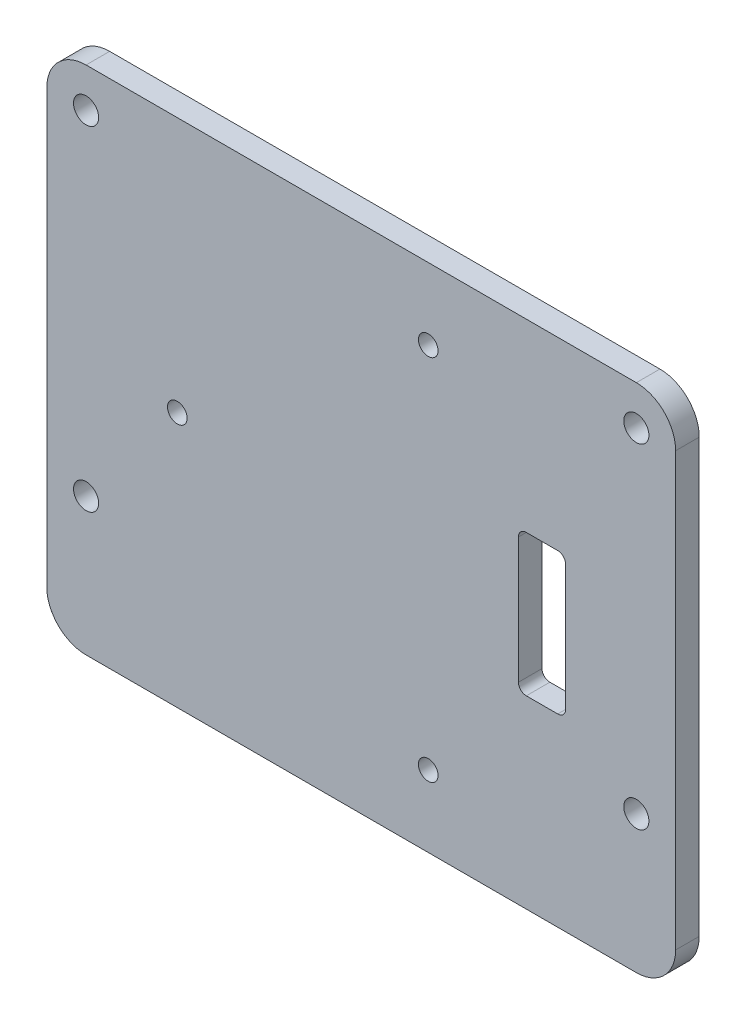
ISO-10303-21;
HEADER;
FILE_DESCRIPTION(('STEP AP214'),'2;1');
FILE_NAME('part.step','',(''),(''),'','','');
FILE_SCHEMA(('AUTOMOTIVE_DESIGN { 1 0 10303 214 1 1 1 1 }'));
ENDSEC;
DATA;
#1=APPLICATION_CONTEXT('core data for automotive mechanical design processes');
#2=APPLICATION_PROTOCOL_DEFINITION('international standard','automotive_design',2000,#1);
#3=PRODUCT_CONTEXT('',#1,'mechanical');
#4=PRODUCT('Part','Part','',(#3));
#5=PRODUCT_RELATED_PRODUCT_CATEGORY('part','',(#4));
#6=PRODUCT_DEFINITION_FORMATION('','',#4);
#7=PRODUCT_DEFINITION_CONTEXT('part definition',#1,'design');
#8=PRODUCT_DEFINITION('design','',#6,#7);
#9=PRODUCT_DEFINITION_SHAPE('','',#8);
#10=(LENGTH_UNIT() NAMED_UNIT(*) SI_UNIT(.MILLI.,.METRE.));
#11=(NAMED_UNIT(*) PLANE_ANGLE_UNIT() SI_UNIT($,.RADIAN.));
#12=(NAMED_UNIT(*) SI_UNIT($,.STERADIAN.) SOLID_ANGLE_UNIT());
#13=UNCERTAINTY_MEASURE_WITH_UNIT(LENGTH_MEASURE(1.E-05),#10,'distance_accuracy_value','');
#14=(GEOMETRIC_REPRESENTATION_CONTEXT(3) GLOBAL_UNCERTAINTY_ASSIGNED_CONTEXT((#13)) GLOBAL_UNIT_ASSIGNED_CONTEXT((#10,
#11,#12)) REPRESENTATION_CONTEXT('',''));
#15=CARTESIAN_POINT('',(0.,0.,0.));
#16=DIRECTION('',(0.,0.,1.));
#17=DIRECTION('',(1.,0.,0.));
#18=AXIS2_PLACEMENT_3D('',#15,#16,#17);
#19=CARTESIAN_POINT('',(0.,0.,3.));
#20=DIRECTION('',(0.,0.,1.));
#21=DIRECTION('',(1.,0.,0.));
#22=AXIS2_PLACEMENT_3D('',#19,#20,#21);
#23=PLANE('',#22);
#24=DIRECTION('',(1.,0.,0.));
#25=VECTOR('',#24,1.);
#26=CARTESIAN_POINT('',(26.,9.,3.));
#27=LINE('',#26,#25);
#28=CARTESIAN_POINT('',(21.,9.,3.));
#29=VERTEX_POINT('',#28);
#30=CARTESIAN_POINT('',(25.,9.,3.));
#31=VERTEX_POINT('',#30);
#32=EDGE_CURVE('E262',#29,#31,#27,.T.);
#33=ORIENTED_EDGE('',*,*,#32,.T.);
#34=CARTESIAN_POINT('',(25.,8.,3.));
#35=DIRECTION('',(0.,0.,1.));
#36=DIRECTION('',(1.,0.,0.));
#37=AXIS2_PLACEMENT_3D('',#34,#35,#36);
#38=CIRCLE('',#37,1.);
#39=CARTESIAN_POINT('',(26.,8.,3.));
#40=VERTEX_POINT('',#39);
#41=EDGE_CURVE('E240',#31,#40,#38,.F.);
#42=ORIENTED_EDGE('',*,*,#41,.T.);
#43=DIRECTION('',(0.,-1.,0.));
#44=VECTOR('',#43,1.);
#45=CARTESIAN_POINT('',(26.,9.,3.));
#46=LINE('',#45,#44);
#47=CARTESIAN_POINT('',(26.,-8.,3.));
#48=VERTEX_POINT('',#47);
#49=EDGE_CURVE('E283',#40,#48,#46,.T.);
#50=ORIENTED_EDGE('',*,*,#49,.T.);
#51=CARTESIAN_POINT('',(25.,-8.,3.));
#52=DIRECTION('',(0.,0.,1.));
#53=DIRECTION('',(1.,0.,0.));
#54=AXIS2_PLACEMENT_3D('',#51,#52,#53);
#55=CIRCLE('',#54,1.);
#56=CARTESIAN_POINT('',(25.,-9.,3.));
#57=VERTEX_POINT('',#56);
#58=EDGE_CURVE('E236',#48,#57,#55,.F.);
#59=ORIENTED_EDGE('',*,*,#58,.T.);
#60=DIRECTION('',(-1.,0.,0.));
#61=VECTOR('',#60,1.);
#62=CARTESIAN_POINT('',(26.,-9.,3.));
#63=LINE('',#62,#61);
#64=CARTESIAN_POINT('',(21.,-9.,3.));
#65=VERTEX_POINT('',#64);
#66=EDGE_CURVE('E273',#57,#65,#63,.T.);
#67=ORIENTED_EDGE('',*,*,#66,.T.);
#68=CARTESIAN_POINT('',(21.,-8.,3.));
#69=DIRECTION('',(0.,0.,1.));
#70=DIRECTION('',(1.,0.,0.));
#71=AXIS2_PLACEMENT_3D('',#68,#69,#70);
#72=CIRCLE('',#71,1.);
#73=CARTESIAN_POINT('',(20.,-8.,3.));
#74=VERTEX_POINT('',#73);
#75=EDGE_CURVE('E59',#65,#74,#72,.F.);
#76=ORIENTED_EDGE('',*,*,#75,.T.);
#77=DIRECTION('',(0.,1.,0.));
#78=VECTOR('',#77,1.);
#79=CARTESIAN_POINT('',(20.,9.,3.));
#80=LINE('',#79,#78);
#81=CARTESIAN_POINT('',(20.,8.,3.));
#82=VERTEX_POINT('',#81);
#83=EDGE_CURVE('E264',#74,#82,#80,.T.);
#84=ORIENTED_EDGE('',*,*,#83,.T.);
#85=CARTESIAN_POINT('',(21.,8.,3.));
#86=DIRECTION('',(0.,0.,1.));
#87=DIRECTION('',(1.,0.,0.));
#88=AXIS2_PLACEMENT_3D('',#85,#86,#87);
#89=CIRCLE('',#88,1.);
#90=EDGE_CURVE('E11',#82,#29,#89,.F.);
#91=ORIENTED_EDGE('',*,*,#90,.T.);
#92=EDGE_LOOP('',(#33,#42,#50,#59,#67,#76,#84,#91));
#93=FACE_BOUND('',#92,.T.);
#94=CARTESIAN_POINT('',(35.,-15.,3.));
#95=DIRECTION('',(0.,0.,-1.));
#96=DIRECTION('',(-1.,0.,0.));
#97=AXIS2_PLACEMENT_3D('',#94,#95,#96);
#98=CIRCLE('',#97,1.6);
#99=CARTESIAN_POINT('',(33.4,-15.,3.));
#100=VERTEX_POINT('',#99);
#101=EDGE_CURVE('E287',#100,#100,#98,.T.);
#102=ORIENTED_EDGE('',*,*,#101,.T.);
#103=EDGE_LOOP('',(#102));
#104=FACE_BOUND('',#103,.T.);
#105=CARTESIAN_POINT('',(-35.,27.5,3.));
#106=DIRECTION('',(0.,0.,-1.));
#107=DIRECTION('',(-1.,0.,0.));
#108=AXIS2_PLACEMENT_3D('',#105,#106,#107);
#109=CIRCLE('',#108,1.6);
#110=CARTESIAN_POINT('',(-36.6,27.5,3.));
#111=VERTEX_POINT('',#110);
#112=EDGE_CURVE('E294',#111,#111,#109,.T.);
#113=ORIENTED_EDGE('',*,*,#112,.T.);
#114=EDGE_LOOP('',(#113));
#115=FACE_BOUND('',#114,.T.);
#116=CARTESIAN_POINT('',(-35.,-15.,3.));
#117=DIRECTION('',(0.,0.,-1.));
#118=DIRECTION('',(-1.,0.,0.));
#119=AXIS2_PLACEMENT_3D('',#116,#117,#118);
#120=CIRCLE('',#119,1.6);
#121=CARTESIAN_POINT('',(-36.6,-15.,3.));
#122=VERTEX_POINT('',#121);
#123=EDGE_CURVE('E271',#122,#122,#120,.T.);
#124=ORIENTED_EDGE('',*,*,#123,.T.);
#125=EDGE_LOOP('',(#124));
#126=FACE_BOUND('',#125,.T.);
#127=CARTESIAN_POINT('',(35.,27.5,3.));
#128=DIRECTION('',(0.,0.,-1.));
#129=DIRECTION('',(-1.,0.,0.));
#130=AXIS2_PLACEMENT_3D('',#127,#128,#129);
#131=CIRCLE('',#130,1.6);
#132=CARTESIAN_POINT('',(33.4,27.5,3.));
#133=VERTEX_POINT('',#132);
#134=EDGE_CURVE('E299',#133,#133,#131,.T.);
#135=ORIENTED_EDGE('',*,*,#134,.T.);
#136=EDGE_LOOP('',(#135));
#137=FACE_BOUND('',#136,.T.);
#138=CARTESIAN_POINT('',(8.52683370307192,-23.3999945261768,3.));
#139=DIRECTION('',(0.,0.,1.));
#140=DIRECTION('',(1.,0.,0.));
#141=AXIS2_PLACEMENT_3D('',#138,#139,#140);
#142=CIRCLE('',#141,1.25);
#143=CARTESIAN_POINT('',(9.77683370307192,-23.3999945261768,3.));
#144=VERTEX_POINT('',#143);
#145=EDGE_CURVE('E311',#144,#144,#142,.T.);
#146=ORIENTED_EDGE('',*,*,#145,.F.);
#147=EDGE_LOOP('',(#146));
#148=FACE_BOUND('',#147,.T.);
#149=DIRECTION('',(1.,0.,0.));
#150=VECTOR('',#149,1.);
#151=CARTESIAN_POINT('',(-40.,-32.5,3.));
#152=LINE('',#151,#150);
#153=CARTESIAN_POINT('',(-35.,-32.5,3.));
#154=VERTEX_POINT('',#153);
#155=CARTESIAN_POINT('',(35.,-32.5,3.));
#156=VERTEX_POINT('',#155);
#157=EDGE_CURVE('E324',#154,#156,#152,.T.);
#158=ORIENTED_EDGE('',*,*,#157,.T.);
#159=CARTESIAN_POINT('',(35.,-27.5,3.));
#160=DIRECTION('',(0.,0.,1.));
#161=DIRECTION('',(1.,0.,0.));
#162=AXIS2_PLACEMENT_3D('',#159,#160,#161);
#163=CIRCLE('',#162,5.);
#164=CARTESIAN_POINT('',(40.,-27.5,3.));
#165=VERTEX_POINT('',#164);
#166=EDGE_CURVE('E203',#156,#165,#163,.T.);
#167=ORIENTED_EDGE('',*,*,#166,.T.);
#168=DIRECTION('',(0.,1.,0.));
#169=VECTOR('',#168,1.);
#170=CARTESIAN_POINT('',(40.,32.5,3.));
#171=LINE('',#170,#169);
#172=CARTESIAN_POINT('',(40.,27.5,3.));
#173=VERTEX_POINT('',#172);
#174=EDGE_CURVE('E171',#165,#173,#171,.T.);
#175=ORIENTED_EDGE('',*,*,#174,.T.);
#176=CARTESIAN_POINT('',(35.,27.5,3.));
#177=DIRECTION('',(0.,0.,1.));
#178=DIRECTION('',(1.,0.,0.));
#179=AXIS2_PLACEMENT_3D('',#176,#177,#178);
#180=CIRCLE('',#179,5.);
#181=CARTESIAN_POINT('',(35.,32.5,3.));
#182=VERTEX_POINT('',#181);
#183=EDGE_CURVE('E199',#173,#182,#180,.T.);
#184=ORIENTED_EDGE('',*,*,#183,.T.);
#185=DIRECTION('',(-1.,0.,0.));
#186=VECTOR('',#185,1.);
#187=CARTESIAN_POINT('',(-40.,32.5,3.));
#188=LINE('',#187,#186);
#189=CARTESIAN_POINT('',(-35.,32.5,3.));
#190=VERTEX_POINT('',#189);
#191=EDGE_CURVE('E189',#182,#190,#188,.T.);
#192=ORIENTED_EDGE('',*,*,#191,.T.);
#193=CARTESIAN_POINT('',(-35.,27.5,3.));
#194=DIRECTION('',(0.,0.,1.));
#195=DIRECTION('',(1.,0.,0.));
#196=AXIS2_PLACEMENT_3D('',#193,#194,#195);
#197=CIRCLE('',#196,5.);
#198=CARTESIAN_POINT('',(-40.,27.5,3.));
#199=VERTEX_POINT('',#198);
#200=EDGE_CURVE('E197',#190,#199,#197,.T.);
#201=ORIENTED_EDGE('',*,*,#200,.T.);
#202=DIRECTION('',(0.,-1.,0.));
#203=VECTOR('',#202,1.);
#204=CARTESIAN_POINT('',(-40.,32.5,3.));
#205=LINE('',#204,#203);
#206=CARTESIAN_POINT('',(-40.,-27.5,3.));
#207=VERTEX_POINT('',#206);
#208=EDGE_CURVE('E183',#199,#207,#205,.T.);
#209=ORIENTED_EDGE('',*,*,#208,.T.);
#210=CARTESIAN_POINT('',(-35.,-27.5,3.));
#211=DIRECTION('',(0.,0.,1.));
#212=DIRECTION('',(1.,0.,0.));
#213=AXIS2_PLACEMENT_3D('',#210,#211,#212);
#214=CIRCLE('',#213,5.);
#215=EDGE_CURVE('E201',#207,#154,#214,.T.);
#216=ORIENTED_EDGE('',*,*,#215,.T.);
#217=EDGE_LOOP('',(#158,#167,#175,#184,#192,#201,#209,#216));
#218=FACE_BOUND('',#217,.T.);
#219=CARTESIAN_POINT('',(8.52683370307192,23.4000054738232,3.));
#220=DIRECTION('',(0.,0.,1.));
#221=DIRECTION('',(1.,0.,0.));
#222=AXIS2_PLACEMENT_3D('',#219,#220,#221);
#223=CIRCLE('',#222,1.25);
#224=CARTESIAN_POINT('',(9.77683370307192,23.4000054738232,3.));
#225=VERTEX_POINT('',#224);
#226=EDGE_CURVE('E317',#225,#225,#223,.T.);
#227=ORIENTED_EDGE('',*,*,#226,.F.);
#228=EDGE_LOOP('',(#227));
#229=FACE_BOUND('',#228,.T.);
#230=CARTESIAN_POINT('',(-23.3931662969281,5.4738231953523E-06,3.));
#231=DIRECTION('',(0.,0.,1.));
#232=DIRECTION('',(1.,0.,0.));
#233=AXIS2_PLACEMENT_3D('',#230,#231,#232);
#234=CIRCLE('',#233,1.25);
#235=CARTESIAN_POINT('',(-22.1431662969281,5.4738231953523E-06,3.));
#236=VERTEX_POINT('',#235);
#237=EDGE_CURVE('E305',#236,#236,#234,.T.);
#238=ORIENTED_EDGE('',*,*,#237,.F.);
#239=EDGE_LOOP('',(#238));
#240=FACE_BOUND('',#239,.T.);
#241=ADVANCED_FACE('F37',(#93,#104,#115,#126,#137,#148,#218,#229,#240),#23,.T.);
#242=CARTESIAN_POINT('',(0.,0.,0.));
#243=DIRECTION('',(0.,0.,1.));
#244=DIRECTION('',(1.,0.,0.));
#245=AXIS2_PLACEMENT_3D('',#242,#243,#244);
#246=PLANE('',#245);
#247=DIRECTION('',(-1.,0.,0.));
#248=VECTOR('',#247,1.);
#249=CARTESIAN_POINT('',(26.,-9.,0.));
#250=LINE('',#249,#248);
#251=CARTESIAN_POINT('',(25.,-9.,0.));
#252=VERTEX_POINT('',#251);
#253=CARTESIAN_POINT('',(21.,-9.,0.));
#254=VERTEX_POINT('',#253);
#255=EDGE_CURVE('E256',#252,#254,#250,.T.);
#256=ORIENTED_EDGE('',*,*,#255,.F.);
#257=CARTESIAN_POINT('',(25.,-8.,0.));
#258=DIRECTION('',(0.,0.,1.));
#259=DIRECTION('',(1.,0.,0.));
#260=AXIS2_PLACEMENT_3D('',#257,#258,#259);
#261=CIRCLE('',#260,1.);
#262=CARTESIAN_POINT('',(26.,-8.,0.));
#263=VERTEX_POINT('',#262);
#264=EDGE_CURVE('E234',#252,#263,#261,.T.);
#265=ORIENTED_EDGE('',*,*,#264,.T.);
#266=DIRECTION('',(0.,-1.,0.));
#267=VECTOR('',#266,1.);
#268=CARTESIAN_POINT('',(26.,9.,0.));
#269=LINE('',#268,#267);
#270=CARTESIAN_POINT('',(26.,8.,0.));
#271=VERTEX_POINT('',#270);
#272=EDGE_CURVE('E277',#271,#263,#269,.T.);
#273=ORIENTED_EDGE('',*,*,#272,.F.);
#274=CARTESIAN_POINT('',(25.,8.,0.));
#275=DIRECTION('',(0.,0.,1.));
#276=DIRECTION('',(1.,0.,0.));
#277=AXIS2_PLACEMENT_3D('',#274,#275,#276);
#278=CIRCLE('',#277,1.);
#279=CARTESIAN_POINT('',(25.,9.,0.));
#280=VERTEX_POINT('',#279);
#281=EDGE_CURVE('E238',#271,#280,#278,.T.);
#282=ORIENTED_EDGE('',*,*,#281,.T.);
#283=DIRECTION('',(1.,0.,0.));
#284=VECTOR('',#283,1.);
#285=CARTESIAN_POINT('',(26.,9.,0.));
#286=LINE('',#285,#284);
#287=CARTESIAN_POINT('',(21.,9.,0.));
#288=VERTEX_POINT('',#287);
#289=EDGE_CURVE('E251',#288,#280,#286,.T.);
#290=ORIENTED_EDGE('',*,*,#289,.F.);
#291=CARTESIAN_POINT('',(21.,8.,0.));
#292=DIRECTION('',(0.,0.,1.));
#293=DIRECTION('',(1.,0.,0.));
#294=AXIS2_PLACEMENT_3D('',#291,#292,#293);
#295=CIRCLE('',#294,1.);
#296=CARTESIAN_POINT('',(20.,8.,0.));
#297=VERTEX_POINT('',#296);
#298=EDGE_CURVE('E45',#288,#297,#295,.T.);
#299=ORIENTED_EDGE('',*,*,#298,.T.);
#300=DIRECTION('',(0.,1.,0.));
#301=VECTOR('',#300,1.);
#302=CARTESIAN_POINT('',(20.,9.,0.));
#303=LINE('',#302,#301);
#304=CARTESIAN_POINT('',(20.,-8.,0.));
#305=VERTEX_POINT('',#304);
#306=EDGE_CURVE('E249',#305,#297,#303,.T.);
#307=ORIENTED_EDGE('',*,*,#306,.F.);
#308=CARTESIAN_POINT('',(21.,-8.,0.));
#309=DIRECTION('',(0.,0.,1.));
#310=DIRECTION('',(1.,0.,0.));
#311=AXIS2_PLACEMENT_3D('',#308,#309,#310);
#312=CIRCLE('',#311,1.);
#313=EDGE_CURVE('E242',#305,#254,#312,.T.);
#314=ORIENTED_EDGE('',*,*,#313,.T.);
#315=EDGE_LOOP('',(#256,#265,#273,#282,#290,#299,#307,#314));
#316=FACE_BOUND('',#315,.T.);
#317=CARTESIAN_POINT('',(35.,-15.,0.));
#318=DIRECTION('',(0.,0.,-1.));
#319=DIRECTION('',(-1.,0.,0.));
#320=AXIS2_PLACEMENT_3D('',#317,#318,#319);
#321=CIRCLE('',#320,1.6);
#322=CARTESIAN_POINT('',(33.4,-15.,0.));
#323=VERTEX_POINT('',#322);
#324=EDGE_CURVE('E291',#323,#323,#321,.T.);
#325=ORIENTED_EDGE('',*,*,#324,.F.);
#326=EDGE_LOOP('',(#325));
#327=FACE_BOUND('',#326,.T.);
#328=CARTESIAN_POINT('',(-35.,27.5,0.));
#329=DIRECTION('',(0.,0.,-1.));
#330=DIRECTION('',(-1.,0.,0.));
#331=AXIS2_PLACEMENT_3D('',#328,#329,#330);
#332=CIRCLE('',#331,1.6);
#333=CARTESIAN_POINT('',(-36.6,27.5,0.));
#334=VERTEX_POINT('',#333);
#335=EDGE_CURVE('E285',#334,#334,#332,.T.);
#336=ORIENTED_EDGE('',*,*,#335,.F.);
#337=EDGE_LOOP('',(#336));
#338=FACE_BOUND('',#337,.T.);
#339=CARTESIAN_POINT('',(-35.,-15.,0.));
#340=DIRECTION('',(0.,0.,-1.));
#341=DIRECTION('',(-1.,0.,0.));
#342=AXIS2_PLACEMENT_3D('',#339,#340,#341);
#343=CIRCLE('',#342,1.6);
#344=CARTESIAN_POINT('',(-36.6,-15.,0.));
#345=VERTEX_POINT('',#344);
#346=EDGE_CURVE('E268',#345,#345,#343,.T.);
#347=ORIENTED_EDGE('',*,*,#346,.F.);
#348=EDGE_LOOP('',(#347));
#349=FACE_BOUND('',#348,.T.);
#350=CARTESIAN_POINT('',(35.,27.5,0.));
#351=DIRECTION('',(0.,0.,-1.));
#352=DIRECTION('',(-1.,0.,0.));
#353=AXIS2_PLACEMENT_3D('',#350,#351,#352);
#354=CIRCLE('',#353,1.6);
#355=CARTESIAN_POINT('',(33.4,27.5,0.));
#356=VERTEX_POINT('',#355);
#357=EDGE_CURVE('E290',#356,#356,#354,.T.);
#358=ORIENTED_EDGE('',*,*,#357,.F.);
#359=EDGE_LOOP('',(#358));
#360=FACE_BOUND('',#359,.T.);
#361=DIRECTION('',(0.,1.,0.));
#362=VECTOR('',#361,1.);
#363=CARTESIAN_POINT('',(40.,32.5,0.));
#364=LINE('',#363,#362);
#365=CARTESIAN_POINT('',(40.,-27.5,0.));
#366=VERTEX_POINT('',#365);
#367=CARTESIAN_POINT('',(40.,27.5,0.));
#368=VERTEX_POINT('',#367);
#369=EDGE_CURVE('E168',#366,#368,#364,.T.);
#370=ORIENTED_EDGE('',*,*,#369,.F.);
#371=CARTESIAN_POINT('',(35.,-27.5,0.));
#372=DIRECTION('',(0.,0.,1.));
#373=DIRECTION('',(1.,0.,0.));
#374=AXIS2_PLACEMENT_3D('',#371,#372,#373);
#375=CIRCLE('',#374,5.);
#376=CARTESIAN_POINT('',(35.,-32.5,0.));
#377=VERTEX_POINT('',#376);
#378=EDGE_CURVE('E151',#366,#377,#375,.F.);
#379=ORIENTED_EDGE('',*,*,#378,.T.);
#380=DIRECTION('',(1.,0.,0.));
#381=VECTOR('',#380,1.);
#382=CARTESIAN_POINT('',(-40.,-32.5,0.));
#383=LINE('',#382,#381);
#384=CARTESIAN_POINT('',(-35.,-32.5,0.));
#385=VERTEX_POINT('',#384);
#386=EDGE_CURVE('E180',#385,#377,#383,.T.);
#387=ORIENTED_EDGE('',*,*,#386,.F.);
#388=CARTESIAN_POINT('',(-35.,-27.5,0.));
#389=DIRECTION('',(0.,0.,1.));
#390=DIRECTION('',(1.,0.,0.));
#391=AXIS2_PLACEMENT_3D('',#388,#389,#390);
#392=CIRCLE('',#391,5.);
#393=CARTESIAN_POINT('',(-40.,-27.5,0.));
#394=VERTEX_POINT('',#393);
#395=EDGE_CURVE('E162',#385,#394,#392,.F.);
#396=ORIENTED_EDGE('',*,*,#395,.T.);
#397=DIRECTION('',(0.,-1.,0.));
#398=VECTOR('',#397,1.);
#399=CARTESIAN_POINT('',(-40.,32.5,0.));
#400=LINE('',#399,#398);
#401=CARTESIAN_POINT('',(-40.,27.5,0.));
#402=VERTEX_POINT('',#401);
#403=EDGE_CURVE('E185',#402,#394,#400,.T.);
#404=ORIENTED_EDGE('',*,*,#403,.F.);
#405=CARTESIAN_POINT('',(-35.,27.5,0.));
#406=DIRECTION('',(0.,0.,1.));
#407=DIRECTION('',(1.,0.,0.));
#408=AXIS2_PLACEMENT_3D('',#405,#406,#407);
#409=CIRCLE('',#408,5.);
#410=CARTESIAN_POINT('',(-35.,32.5,0.));
#411=VERTEX_POINT('',#410);
#412=EDGE_CURVE('E172',#402,#411,#409,.F.);
#413=ORIENTED_EDGE('',*,*,#412,.T.);
#414=DIRECTION('',(-1.,0.,0.));
#415=VECTOR('',#414,1.);
#416=CARTESIAN_POINT('',(-40.,32.5,0.));
#417=LINE('',#416,#415);
#418=CARTESIAN_POINT('',(35.,32.5,0.));
#419=VERTEX_POINT('',#418);
#420=EDGE_CURVE('E179',#419,#411,#417,.T.);
#421=ORIENTED_EDGE('',*,*,#420,.F.);
#422=CARTESIAN_POINT('',(35.,27.5,0.));
#423=DIRECTION('',(0.,0.,1.));
#424=DIRECTION('',(1.,0.,0.));
#425=AXIS2_PLACEMENT_3D('',#422,#423,#424);
#426=CIRCLE('',#425,5.);
#427=EDGE_CURVE('E178',#419,#368,#426,.F.);
#428=ORIENTED_EDGE('',*,*,#427,.T.);
#429=EDGE_LOOP('',(#370,#379,#387,#396,#404,#413,#421,#428));
#430=FACE_BOUND('',#429,.T.);
#431=CARTESIAN_POINT('',(8.52683370307192,23.4000054738232,0.));
#432=DIRECTION('',(0.,0.,1.));
#433=DIRECTION('',(1.,0.,0.));
#434=AXIS2_PLACEMENT_3D('',#431,#432,#433);
#435=CIRCLE('',#434,1.25);
#436=CARTESIAN_POINT('',(9.77683370307192,23.4000054738232,0.));
#437=VERTEX_POINT('',#436);
#438=EDGE_CURVE('E314',#437,#437,#435,.T.);
#439=ORIENTED_EDGE('',*,*,#438,.T.);
#440=EDGE_LOOP('',(#439));
#441=FACE_BOUND('',#440,.T.);
#442=CARTESIAN_POINT('',(8.52683370307192,-23.3999945261768,0.));
#443=DIRECTION('',(0.,0.,1.));
#444=DIRECTION('',(1.,0.,0.));
#445=AXIS2_PLACEMENT_3D('',#442,#443,#444);
#446=CIRCLE('',#445,1.25);
#447=CARTESIAN_POINT('',(9.77683370307192,-23.3999945261768,0.));
#448=VERTEX_POINT('',#447);
#449=EDGE_CURVE('E308',#448,#448,#446,.T.);
#450=ORIENTED_EDGE('',*,*,#449,.T.);
#451=EDGE_LOOP('',(#450));
#452=FACE_BOUND('',#451,.T.);
#453=CARTESIAN_POINT('',(-23.3931662969281,5.4738231953523E-06,0.));
#454=DIRECTION('',(0.,0.,1.));
#455=DIRECTION('',(1.,0.,0.));
#456=AXIS2_PLACEMENT_3D('',#453,#454,#455);
#457=CIRCLE('',#456,1.25);
#458=CARTESIAN_POINT('',(-22.1431662969281,5.4738231953523E-06,0.));
#459=VERTEX_POINT('',#458);
#460=EDGE_CURVE('E302',#459,#459,#457,.T.);
#461=ORIENTED_EDGE('',*,*,#460,.T.);
#462=EDGE_LOOP('',(#461));
#463=FACE_BOUND('',#462,.T.);
#464=ADVANCED_FACE('F175',(#316,#327,#338,#349,#360,#430,#441,#452,#463),#246,.F.);
#465=CARTESIAN_POINT('',(-40.,32.5,3.));
#466=DIRECTION('',(1.,0.,0.));
#467=DIRECTION('',(0.,1.,0.));
#468=AXIS2_PLACEMENT_3D('',#465,#466,#467);
#469=PLANE('',#468);
#470=ORIENTED_EDGE('',*,*,#403,.T.);
#471=DIRECTION('',(0.,0.,-1.));
#472=VECTOR('',#471,1.);
#473=CARTESIAN_POINT('',(-40.,-27.5,3.));
#474=LINE('',#473,#472);
#475=EDGE_CURVE('E208',#394,#207,#474,.F.);
#476=ORIENTED_EDGE('',*,*,#475,.T.);
#477=ORIENTED_EDGE('',*,*,#208,.F.);
#478=DIRECTION('',(0.,0.,-1.));
#479=VECTOR('',#478,1.);
#480=CARTESIAN_POINT('',(-40.,27.5,3.));
#481=LINE('',#480,#479);
#482=EDGE_CURVE('E205',#199,#402,#481,.T.);
#483=ORIENTED_EDGE('',*,*,#482,.T.);
#484=EDGE_LOOP('',(#470,#476,#477,#483));
#485=FACE_BOUND('',#484,.T.);
#486=ADVANCED_FACE('F333',(#485),#469,.F.);
#487=CARTESIAN_POINT('',(-40.,-32.5,3.));
#488=DIRECTION('',(0.,1.,0.));
#489=DIRECTION('',(0.,0.,1.));
#490=AXIS2_PLACEMENT_3D('',#487,#488,#489);
#491=PLANE('',#490);
#492=ORIENTED_EDGE('',*,*,#386,.T.);
#493=DIRECTION('',(0.,0.,-1.));
#494=VECTOR('',#493,1.);
#495=CARTESIAN_POINT('',(35.,-32.5,3.));
#496=LINE('',#495,#494);
#497=EDGE_CURVE('E156',#377,#156,#496,.F.);
#498=ORIENTED_EDGE('',*,*,#497,.T.);
#499=ORIENTED_EDGE('',*,*,#157,.F.);
#500=DIRECTION('',(0.,0.,-1.));
#501=VECTOR('',#500,1.);
#502=CARTESIAN_POINT('',(-35.,-32.5,3.));
#503=LINE('',#502,#501);
#504=EDGE_CURVE('E161',#154,#385,#503,.T.);
#505=ORIENTED_EDGE('',*,*,#504,.T.);
#506=EDGE_LOOP('',(#492,#498,#499,#505));
#507=FACE_BOUND('',#506,.T.);
#508=ADVANCED_FACE('F344',(#507),#491,.F.);
#509=CARTESIAN_POINT('',(40.,32.5,3.));
#510=DIRECTION('',(-1.,0.,0.));
#511=DIRECTION('',(0.,0.,1.));
#512=AXIS2_PLACEMENT_3D('',#509,#510,#511);
#513=PLANE('',#512);
#514=ORIENTED_EDGE('',*,*,#174,.F.);
#515=DIRECTION('',(0.,0.,-1.));
#516=VECTOR('',#515,1.);
#517=CARTESIAN_POINT('',(40.,-27.5,3.));
#518=LINE('',#517,#516);
#519=EDGE_CURVE('E155',#165,#366,#518,.T.);
#520=ORIENTED_EDGE('',*,*,#519,.T.);
#521=ORIENTED_EDGE('',*,*,#369,.T.);
#522=DIRECTION('',(0.,0.,-1.));
#523=VECTOR('',#522,1.);
#524=CARTESIAN_POINT('',(40.,27.5,3.));
#525=LINE('',#524,#523);
#526=EDGE_CURVE('E173',#368,#173,#525,.F.);
#527=ORIENTED_EDGE('',*,*,#526,.T.);
#528=EDGE_LOOP('',(#514,#520,#521,#527));
#529=FACE_BOUND('',#528,.T.);
#530=ADVANCED_FACE('F167',(#529),#513,.F.);
#531=CARTESIAN_POINT('',(-40.,32.5,3.));
#532=DIRECTION('',(0.,-1.,0.));
#533=DIRECTION('',(0.,0.,-1.));
#534=AXIS2_PLACEMENT_3D('',#531,#532,#533);
#535=PLANE('',#534);
#536=ORIENTED_EDGE('',*,*,#191,.F.);
#537=DIRECTION('',(0.,0.,-1.));
#538=VECTOR('',#537,1.);
#539=CARTESIAN_POINT('',(35.,32.5,3.));
#540=LINE('',#539,#538);
#541=EDGE_CURVE('E212',#182,#419,#540,.T.);
#542=ORIENTED_EDGE('',*,*,#541,.T.);
#543=ORIENTED_EDGE('',*,*,#420,.T.);
#544=DIRECTION('',(0.,0.,-1.));
#545=VECTOR('',#544,1.);
#546=CARTESIAN_POINT('',(-35.,32.5,3.));
#547=LINE('',#546,#545);
#548=EDGE_CURVE('E210',#411,#190,#547,.F.);
#549=ORIENTED_EDGE('',*,*,#548,.T.);
#550=EDGE_LOOP('',(#536,#542,#543,#549));
#551=FACE_BOUND('',#550,.T.);
#552=ADVANCED_FACE('F351',(#551),#535,.F.);
#553=CARTESIAN_POINT('',(8.52683370307192,23.4000054738232,3.));
#554=DIRECTION('',(0.,0.,-1.));
#555=DIRECTION('',(-1.,0.,0.));
#556=AXIS2_PLACEMENT_3D('',#553,#554,#555);
#557=CYLINDRICAL_SURFACE('',#556,1.25);
#558=ORIENTED_EDGE('',*,*,#226,.T.);
#559=EDGE_LOOP('',(#558));
#560=FACE_BOUND('',#559,.T.);
#561=ORIENTED_EDGE('',*,*,#438,.F.);
#562=EDGE_LOOP('',(#561));
#563=FACE_BOUND('',#562,.T.);
#564=ADVANCED_FACE('F361',(#560,#563),#557,.F.);
#565=CARTESIAN_POINT('',(8.52683370307192,-23.3999945261768,3.));
#566=DIRECTION('',(0.,0.,-1.));
#567=DIRECTION('',(-1.,0.,0.));
#568=AXIS2_PLACEMENT_3D('',#565,#566,#567);
#569=CYLINDRICAL_SURFACE('',#568,1.25);
#570=ORIENTED_EDGE('',*,*,#145,.T.);
#571=EDGE_LOOP('',(#570));
#572=FACE_BOUND('',#571,.T.);
#573=ORIENTED_EDGE('',*,*,#449,.F.);
#574=EDGE_LOOP('',(#573));
#575=FACE_BOUND('',#574,.T.);
#576=ADVANCED_FACE('F369',(#572,#575),#569,.F.);
#577=CARTESIAN_POINT('',(-23.3931662969281,5.4738231953523E-06,3.));
#578=DIRECTION('',(0.,0.,-1.));
#579=DIRECTION('',(-1.,0.,0.));
#580=AXIS2_PLACEMENT_3D('',#577,#578,#579);
#581=CYLINDRICAL_SURFACE('',#580,1.25);
#582=ORIENTED_EDGE('',*,*,#237,.T.);
#583=EDGE_LOOP('',(#582));
#584=FACE_BOUND('',#583,.T.);
#585=ORIENTED_EDGE('',*,*,#460,.F.);
#586=EDGE_LOOP('',(#585));
#587=FACE_BOUND('',#586,.T.);
#588=ADVANCED_FACE('F442',(#584,#587),#581,.F.);
#589=CARTESIAN_POINT('',(35.,-27.5,3.));
#590=DIRECTION('',(0.,0.,-1.));
#591=DIRECTION('',(-1.,0.,0.));
#592=AXIS2_PLACEMENT_3D('',#589,#590,#591);
#593=CYLINDRICAL_SURFACE('',#592,5.);
#594=ORIENTED_EDGE('',*,*,#166,.F.);
#595=ORIENTED_EDGE('',*,*,#497,.F.);
#596=ORIENTED_EDGE('',*,*,#378,.F.);
#597=ORIENTED_EDGE('',*,*,#519,.F.);
#598=EDGE_LOOP('',(#594,#595,#596,#597));
#599=FACE_BOUND('',#598,.T.);
#600=ADVANCED_FACE('F154',(#599),#593,.T.);
#601=CARTESIAN_POINT('',(-35.,-27.5,3.));
#602=DIRECTION('',(0.,0.,-1.));
#603=DIRECTION('',(-1.,0.,0.));
#604=AXIS2_PLACEMENT_3D('',#601,#602,#603);
#605=CYLINDRICAL_SURFACE('',#604,5.);
#606=ORIENTED_EDGE('',*,*,#215,.F.);
#607=ORIENTED_EDGE('',*,*,#475,.F.);
#608=ORIENTED_EDGE('',*,*,#395,.F.);
#609=ORIENTED_EDGE('',*,*,#504,.F.);
#610=EDGE_LOOP('',(#606,#607,#608,#609));
#611=FACE_BOUND('',#610,.T.);
#612=ADVANCED_FACE('F338',(#611),#605,.T.);
#613=CARTESIAN_POINT('',(35.,27.5,3.));
#614=DIRECTION('',(0.,0.,-1.));
#615=DIRECTION('',(-1.,0.,0.));
#616=AXIS2_PLACEMENT_3D('',#613,#614,#615);
#617=CYLINDRICAL_SURFACE('',#616,5.);
#618=ORIENTED_EDGE('',*,*,#183,.F.);
#619=ORIENTED_EDGE('',*,*,#526,.F.);
#620=ORIENTED_EDGE('',*,*,#427,.F.);
#621=ORIENTED_EDGE('',*,*,#541,.F.);
#622=EDGE_LOOP('',(#618,#619,#620,#621));
#623=FACE_BOUND('',#622,.T.);
#624=ADVANCED_FACE('F377',(#623),#617,.T.);
#625=CARTESIAN_POINT('',(-35.,27.5,3.));
#626=DIRECTION('',(0.,0.,-1.));
#627=DIRECTION('',(-1.,0.,0.));
#628=AXIS2_PLACEMENT_3D('',#625,#626,#627);
#629=CYLINDRICAL_SURFACE('',#628,5.);
#630=ORIENTED_EDGE('',*,*,#200,.F.);
#631=ORIENTED_EDGE('',*,*,#548,.F.);
#632=ORIENTED_EDGE('',*,*,#412,.F.);
#633=ORIENTED_EDGE('',*,*,#482,.F.);
#634=EDGE_LOOP('',(#630,#631,#632,#633));
#635=FACE_BOUND('',#634,.T.);
#636=ADVANCED_FACE('F379',(#635),#629,.T.);
#637=CARTESIAN_POINT('',(35.,27.5,3.));
#638=DIRECTION('',(0.,0.,-1.));
#639=DIRECTION('',(-1.,0.,0.));
#640=AXIS2_PLACEMENT_3D('',#637,#638,#639);
#641=CYLINDRICAL_SURFACE('',#640,1.6);
#642=ORIENTED_EDGE('',*,*,#134,.F.);
#643=EDGE_LOOP('',(#642));
#644=FACE_BOUND('',#643,.T.);
#645=ORIENTED_EDGE('',*,*,#357,.T.);
#646=EDGE_LOOP('',(#645));
#647=FACE_BOUND('',#646,.T.);
#648=ADVANCED_FACE('F385',(#644,#647),#641,.F.);
#649=CARTESIAN_POINT('',(-35.,-15.,3.));
#650=DIRECTION('',(0.,0.,-1.));
#651=DIRECTION('',(-1.,0.,0.));
#652=AXIS2_PLACEMENT_3D('',#649,#650,#651);
#653=CYLINDRICAL_SURFACE('',#652,1.6);
#654=ORIENTED_EDGE('',*,*,#123,.F.);
#655=EDGE_LOOP('',(#654));
#656=FACE_BOUND('',#655,.T.);
#657=ORIENTED_EDGE('',*,*,#346,.T.);
#658=EDGE_LOOP('',(#657));
#659=FACE_BOUND('',#658,.T.);
#660=ADVANCED_FACE('F432',(#656,#659),#653,.F.);
#661=CARTESIAN_POINT('',(-35.,27.5,3.));
#662=DIRECTION('',(0.,0.,-1.));
#663=DIRECTION('',(-1.,0.,0.));
#664=AXIS2_PLACEMENT_3D('',#661,#662,#663);
#665=CYLINDRICAL_SURFACE('',#664,1.6);
#666=ORIENTED_EDGE('',*,*,#112,.F.);
#667=EDGE_LOOP('',(#666));
#668=FACE_BOUND('',#667,.T.);
#669=ORIENTED_EDGE('',*,*,#335,.T.);
#670=EDGE_LOOP('',(#669));
#671=FACE_BOUND('',#670,.T.);
#672=ADVANCED_FACE('F426',(#668,#671),#665,.F.);
#673=CARTESIAN_POINT('',(35.,-15.,3.));
#674=DIRECTION('',(0.,0.,-1.));
#675=DIRECTION('',(-1.,0.,0.));
#676=AXIS2_PLACEMENT_3D('',#673,#674,#675);
#677=CYLINDRICAL_SURFACE('',#676,1.6);
#678=ORIENTED_EDGE('',*,*,#101,.F.);
#679=EDGE_LOOP('',(#678));
#680=FACE_BOUND('',#679,.T.);
#681=ORIENTED_EDGE('',*,*,#324,.T.);
#682=EDGE_LOOP('',(#681));
#683=FACE_BOUND('',#682,.T.);
#684=ADVANCED_FACE('F419',(#680,#683),#677,.F.);
#685=CARTESIAN_POINT('',(26.,9.,3.));
#686=DIRECTION('',(1.,0.,0.));
#687=DIRECTION('',(0.,0.,-1.));
#688=AXIS2_PLACEMENT_3D('',#685,#686,#687);
#689=PLANE('',#688);
#690=ORIENTED_EDGE('',*,*,#272,.T.);
#691=DIRECTION('',(0.,0.,-1.));
#692=VECTOR('',#691,1.);
#693=CARTESIAN_POINT('',(26.,-8.,3.));
#694=LINE('',#693,#692);
#695=EDGE_CURVE('E223',#263,#48,#694,.F.);
#696=ORIENTED_EDGE('',*,*,#695,.T.);
#697=ORIENTED_EDGE('',*,*,#49,.F.);
#698=DIRECTION('',(0.,0.,-1.));
#699=VECTOR('',#698,1.);
#700=CARTESIAN_POINT('',(26.,8.,0.));
#701=LINE('',#700,#699);
#702=EDGE_CURVE('E220',#40,#271,#701,.T.);
#703=ORIENTED_EDGE('',*,*,#702,.T.);
#704=EDGE_LOOP('',(#690,#696,#697,#703));
#705=FACE_BOUND('',#704,.T.);
#706=ADVANCED_FACE('F413',(#705),#689,.F.);
#707=CARTESIAN_POINT('',(26.,9.,3.));
#708=DIRECTION('',(0.,1.,0.));
#709=DIRECTION('',(-1.,0.,0.));
#710=AXIS2_PLACEMENT_3D('',#707,#708,#709);
#711=PLANE('',#710);
#712=ORIENTED_EDGE('',*,*,#289,.T.);
#713=DIRECTION('',(0.,0.,-1.));
#714=VECTOR('',#713,1.);
#715=CARTESIAN_POINT('',(25.,9.,3.));
#716=LINE('',#715,#714);
#717=EDGE_CURVE('E228',#280,#31,#716,.F.);
#718=ORIENTED_EDGE('',*,*,#717,.T.);
#719=ORIENTED_EDGE('',*,*,#32,.F.);
#720=DIRECTION('',(0.,0.,-1.));
#721=VECTOR('',#720,1.);
#722=CARTESIAN_POINT('',(21.,9.,0.));
#723=LINE('',#722,#721);
#724=EDGE_CURVE('E225',#29,#288,#723,.T.);
#725=ORIENTED_EDGE('',*,*,#724,.T.);
#726=EDGE_LOOP('',(#712,#718,#719,#725));
#727=FACE_BOUND('',#726,.T.);
#728=ADVANCED_FACE('F266',(#727),#711,.F.);
#729=CARTESIAN_POINT('',(20.,9.,3.));
#730=DIRECTION('',(-1.,0.,0.));
#731=DIRECTION('',(0.,-1.,0.));
#732=AXIS2_PLACEMENT_3D('',#729,#730,#731);
#733=PLANE('',#732);
#734=ORIENTED_EDGE('',*,*,#83,.F.);
#735=DIRECTION('',(0.,0.,-1.));
#736=VECTOR('',#735,1.);
#737=CARTESIAN_POINT('',(20.,-8.,0.));
#738=LINE('',#737,#736);
#739=EDGE_CURVE('E231',#74,#305,#738,.T.);
#740=ORIENTED_EDGE('',*,*,#739,.T.);
#741=ORIENTED_EDGE('',*,*,#306,.T.);
#742=DIRECTION('',(0.,0.,-1.));
#743=VECTOR('',#742,1.);
#744=CARTESIAN_POINT('',(20.,8.,3.));
#745=LINE('',#744,#743);
#746=EDGE_CURVE('E52',#297,#82,#745,.F.);
#747=ORIENTED_EDGE('',*,*,#746,.T.);
#748=EDGE_LOOP('',(#734,#740,#741,#747));
#749=FACE_BOUND('',#748,.T.);
#750=ADVANCED_FACE('F254',(#749),#733,.F.);
#751=CARTESIAN_POINT('',(26.,-9.,3.));
#752=DIRECTION('',(0.,-1.,0.));
#753=DIRECTION('',(0.,0.,-1.));
#754=AXIS2_PLACEMENT_3D('',#751,#752,#753);
#755=PLANE('',#754);
#756=ORIENTED_EDGE('',*,*,#66,.F.);
#757=DIRECTION('',(0.,0.,-1.));
#758=VECTOR('',#757,1.);
#759=CARTESIAN_POINT('',(25.,-9.,0.));
#760=LINE('',#759,#758);
#761=EDGE_CURVE('E217',#57,#252,#760,.T.);
#762=ORIENTED_EDGE('',*,*,#761,.T.);
#763=ORIENTED_EDGE('',*,*,#255,.T.);
#764=DIRECTION('',(0.,0.,-1.));
#765=VECTOR('',#764,1.);
#766=CARTESIAN_POINT('',(21.,-9.,3.));
#767=LINE('',#766,#765);
#768=EDGE_CURVE('E215',#254,#65,#767,.F.);
#769=ORIENTED_EDGE('',*,*,#768,.T.);
#770=EDGE_LOOP('',(#756,#762,#763,#769));
#771=FACE_BOUND('',#770,.T.);
#772=ADVANCED_FACE('F395',(#771),#755,.F.);
#773=CARTESIAN_POINT('',(25.,-8.,3.));
#774=DIRECTION('',(0.,0.,1.));
#775=DIRECTION('',(1.,0.,0.));
#776=AXIS2_PLACEMENT_3D('',#773,#774,#775);
#777=CYLINDRICAL_SURFACE('',#776,1.);
#778=ORIENTED_EDGE('',*,*,#58,.F.);
#779=ORIENTED_EDGE('',*,*,#695,.F.);
#780=ORIENTED_EDGE('',*,*,#264,.F.);
#781=ORIENTED_EDGE('',*,*,#761,.F.);
#782=EDGE_LOOP('',(#778,#779,#780,#781));
#783=FACE_BOUND('',#782,.T.);
#784=ADVANCED_FACE('F391',(#783),#777,.F.);
#785=CARTESIAN_POINT('',(25.,8.,3.));
#786=DIRECTION('',(0.,0.,1.));
#787=DIRECTION('',(1.,0.,0.));
#788=AXIS2_PLACEMENT_3D('',#785,#786,#787);
#789=CYLINDRICAL_SURFACE('',#788,1.);
#790=ORIENTED_EDGE('',*,*,#41,.F.);
#791=ORIENTED_EDGE('',*,*,#717,.F.);
#792=ORIENTED_EDGE('',*,*,#281,.F.);
#793=ORIENTED_EDGE('',*,*,#702,.F.);
#794=EDGE_LOOP('',(#790,#791,#792,#793));
#795=FACE_BOUND('',#794,.T.);
#796=ADVANCED_FACE('F394',(#795),#789,.F.);
#797=CARTESIAN_POINT('',(21.,-8.,3.));
#798=DIRECTION('',(0.,0.,1.));
#799=DIRECTION('',(1.,0.,0.));
#800=AXIS2_PLACEMENT_3D('',#797,#798,#799);
#801=CYLINDRICAL_SURFACE('',#800,1.);
#802=ORIENTED_EDGE('',*,*,#75,.F.);
#803=ORIENTED_EDGE('',*,*,#768,.F.);
#804=ORIENTED_EDGE('',*,*,#313,.F.);
#805=ORIENTED_EDGE('',*,*,#739,.F.);
#806=EDGE_LOOP('',(#802,#803,#804,#805));
#807=FACE_BOUND('',#806,.T.);
#808=ADVANCED_FACE('F398',(#807),#801,.F.);
#809=CARTESIAN_POINT('',(21.,8.,3.));
#810=DIRECTION('',(0.,0.,1.));
#811=DIRECTION('',(1.,0.,0.));
#812=AXIS2_PLACEMENT_3D('',#809,#810,#811);
#813=CYLINDRICAL_SURFACE('',#812,1.);
#814=ORIENTED_EDGE('',*,*,#90,.F.);
#815=ORIENTED_EDGE('',*,*,#746,.F.);
#816=ORIENTED_EDGE('',*,*,#298,.F.);
#817=ORIENTED_EDGE('',*,*,#724,.F.);
#818=EDGE_LOOP('',(#814,#815,#816,#817));
#819=FACE_BOUND('',#818,.T.);
#820=ADVANCED_FACE('F39',(#819),#813,.F.);
#821=CLOSED_SHELL('',(#241,#464,#486,#508,#530,#552,#564,#576,#588,#600,#612,#624,#636,#648,
#660,#672,#684,#706,#728,#750,#772,#784,#796,#808,#820));
#822=MANIFOLD_SOLID_BREP('B2',#821);
#823=ADVANCED_BREP_SHAPE_REPRESENTATION('',(#18,#822),#14);
#824=SHAPE_DEFINITION_REPRESENTATION(#9,#823);
ENDSEC;
END-ISO-10303-21;
